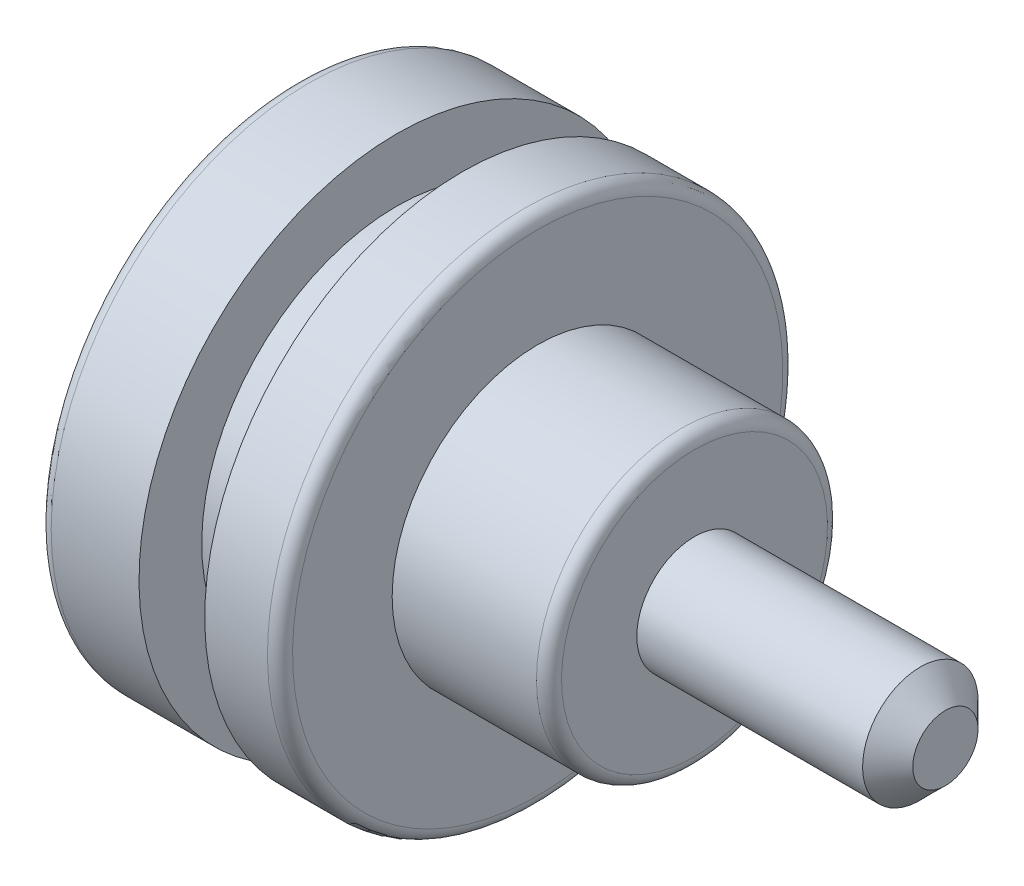
ISO-10303-21;
HEADER;
FILE_DESCRIPTION(('STEP AP214'),'2;1');
FILE_NAME('part.step','',(''),(''),'','','');
FILE_SCHEMA(('AUTOMOTIVE_DESIGN { 1 0 10303 214 1 1 1 1 }'));
ENDSEC;
DATA;
#1=APPLICATION_CONTEXT('core data for automotive mechanical design processes');
#2=APPLICATION_PROTOCOL_DEFINITION('international standard','automotive_design',2000,#1);
#3=PRODUCT_CONTEXT('',#1,'mechanical');
#4=PRODUCT('Part','Part','',(#3));
#5=PRODUCT_RELATED_PRODUCT_CATEGORY('part','',(#4));
#6=PRODUCT_DEFINITION_FORMATION('','',#4);
#7=PRODUCT_DEFINITION_CONTEXT('part definition',#1,'design');
#8=PRODUCT_DEFINITION('design','',#6,#7);
#9=PRODUCT_DEFINITION_SHAPE('','',#8);
#10=(LENGTH_UNIT() NAMED_UNIT(*) SI_UNIT(.MILLI.,.METRE.));
#11=(NAMED_UNIT(*) PLANE_ANGLE_UNIT() SI_UNIT($,.RADIAN.));
#12=(NAMED_UNIT(*) SI_UNIT($,.STERADIAN.) SOLID_ANGLE_UNIT());
#13=UNCERTAINTY_MEASURE_WITH_UNIT(LENGTH_MEASURE(1.E-05),#10,'distance_accuracy_value','');
#14=(GEOMETRIC_REPRESENTATION_CONTEXT(3) GLOBAL_UNCERTAINTY_ASSIGNED_CONTEXT((#13)) GLOBAL_UNIT_ASSIGNED_CONTEXT((#10,
#11,#12)) REPRESENTATION_CONTEXT('',''));
#15=CARTESIAN_POINT('',(0.,0.,0.));
#16=DIRECTION('',(0.,0.,1.));
#17=DIRECTION('',(1.,0.,0.));
#18=AXIS2_PLACEMENT_3D('',#15,#16,#17);
#19=CARTESIAN_POINT('',(25.87,0.,0.));
#20=DIRECTION('',(1.,0.,0.));
#21=DIRECTION('',(0.,1.,0.));
#22=AXIS2_PLACEMENT_3D('',#19,#20,#21);
#23=CYLINDRICAL_SURFACE('',#22,5.);
#24=CARTESIAN_POINT('',(0.500000000000004,0.,0.));
#25=DIRECTION('',(-1.,0.,0.));
#26=DIRECTION('',(0.,-1.,0.));
#27=AXIS2_PLACEMENT_3D('',#24,#25,#26);
#28=CIRCLE('',#27,5.);
#29=CARTESIAN_POINT('',(0.500000000000006,-5.,0.));
#30=VERTEX_POINT('',#29);
#31=EDGE_CURVE('E168',#30,#30,#28,.T.);
#32=ORIENTED_EDGE('',*,*,#31,.T.);
#33=EDGE_LOOP('',(#32));
#34=FACE_BOUND('',#33,.T.);
#35=CARTESIAN_POINT('',(6.5,0.,0.));
#36=DIRECTION('',(1.,0.,0.));
#37=DIRECTION('',(0.,1.,0.));
#38=AXIS2_PLACEMENT_3D('',#35,#36,#37);
#39=CIRCLE('',#38,5.);
#40=CARTESIAN_POINT('',(6.5,4.99999999999999,0.));
#41=VERTEX_POINT('',#40);
#42=EDGE_CURVE('E195',#41,#41,#39,.T.);
#43=ORIENTED_EDGE('',*,*,#42,.T.);
#44=EDGE_LOOP('',(#43));
#45=FACE_BOUND('',#44,.T.);
#46=ADVANCED_FACE('F31',(#34,#45),#23,.F.);
#47=CARTESIAN_POINT('',(0.,4.99999999999999,0.));
#48=DIRECTION('',(-1.,0.,0.));
#49=DIRECTION('',(0.,-1.,0.));
#50=AXIS2_PLACEMENT_3D('',#47,#48,#49);
#51=PLANE('',#50);
#52=CARTESIAN_POINT('',(0.,0.,0.));
#53=DIRECTION('',(-1.,0.,0.));
#54=DIRECTION('',(0.,-1.,0.));
#55=AXIS2_PLACEMENT_3D('',#52,#53,#54);
#56=CIRCLE('',#55,9.77000000000001);
#57=CARTESIAN_POINT('',(0.,-9.77000000000001,0.));
#58=VERTEX_POINT('',#57);
#59=EDGE_CURVE('E173',#58,#58,#56,.T.);
#60=ORIENTED_EDGE('',*,*,#59,.T.);
#61=EDGE_LOOP('',(#60));
#62=FACE_BOUND('',#61,.T.);
#63=CARTESIAN_POINT('',(0.,0.,0.));
#64=DIRECTION('',(-1.,0.,0.));
#65=DIRECTION('',(0.,-1.,0.));
#66=AXIS2_PLACEMENT_3D('',#63,#64,#65);
#67=CIRCLE('',#66,5.5);
#68=CARTESIAN_POINT('',(0.,-5.50000000000001,0.));
#69=VERTEX_POINT('',#68);
#70=EDGE_CURVE('E159',#69,#69,#67,.F.);
#71=ORIENTED_EDGE('',*,*,#70,.T.);
#72=EDGE_LOOP('',(#71));
#73=FACE_BOUND('',#72,.T.);
#74=ADVANCED_FACE('F56',(#62,#73),#51,.T.);
#75=CARTESIAN_POINT('',(25.87,0.,0.));
#76=DIRECTION('',(1.,0.,0.));
#77=DIRECTION('',(0.,1.,0.));
#78=AXIS2_PLACEMENT_3D('',#75,#76,#77);
#79=CYLINDRICAL_SURFACE('',#78,10.27);
#80=CARTESIAN_POINT('',(1.00000000000001,0.,-10.27));
#81=CARTESIAN_POINT('',(1.00000242998855,0.0560281130643778,-10.2699993704205));
#82=CARTESIAN_POINT('',(1.0047245750476,0.112093455686824,-10.2695366323118));
#83=CARTESIAN_POINT('',(1.02349115088352,0.222670323142132,-10.2677351736443));
#84=CARTESIAN_POINT('',(1.03754590160196,0.277180058119849,-10.2663954833801));
#85=CARTESIAN_POINT('',(1.07456511951424,0.383028398348861,-10.2629913753249));
#86=CARTESIAN_POINT('',(1.0975242631602,0.434368877141249,-10.2609273906279));
#87=CARTESIAN_POINT('',(1.15169034189741,0.532456081542478,-10.2563055977148));
#88=CARTESIAN_POINT('',(1.1828956158856,0.579203729733771,-10.2537478889825));
#89=CARTESIAN_POINT('',(1.25278281564404,0.666949574742967,-10.248415459794));
#90=CARTESIAN_POINT('',(1.29148718198973,0.707929861254753,-10.245640103261));
#91=CARTESIAN_POINT('',(1.37522609004017,0.7828238075426,-10.2401904511167));
#92=CARTESIAN_POINT('',(1.42026092181637,0.81673714332349,-10.2375161601435));
#93=CARTESIAN_POINT('',(1.51549392419819,0.876597514777132,-10.2325648790988));
#94=CARTESIAN_POINT('',(1.56570228248863,0.902528415290817,-10.2302886976955));
#95=CARTESIAN_POINT('',(1.6697864058679,0.945584799417025,-10.2263991463674));
#96=CARTESIAN_POINT('',(1.72366208472355,0.962710489993836,-10.224785760864));
#97=CARTESIAN_POINT('',(1.83336933486897,0.987617397594074,-10.2224101623409));
#98=CARTESIAN_POINT('',(1.88919412064404,0.995428241077002,-10.2216452512401));
#99=CARTESIAN_POINT('',(2.00136713942667,1.00157530479113,-10.2210448076504));
#100=CARTESIAN_POINT('',(2.05771535931009,0.999911761938303,-10.2212092519222));
#101=CARTESIAN_POINT('',(2.16913170575749,0.987181704731946,-10.2224464769959));
#102=CARTESIAN_POINT('',(2.22420356492436,0.976147512879492,-10.2235161353673));
#103=CARTESIAN_POINT('',(2.33170996678532,0.945039657925377,-10.2264383843714));
#104=CARTESIAN_POINT('',(2.38414447550893,0.924965878422162,-10.2282909850859));
#105=CARTESIAN_POINT('',(2.48499001088431,0.876312904498565,-10.2325739706715));
#106=CARTESIAN_POINT('',(2.53339406273881,0.847719342337354,-10.2350053301558));
#107=CARTESIAN_POINT('',(2.62472835563628,0.782848799160375,-10.2401710436506));
#108=CARTESIAN_POINT('',(2.66765844477954,0.746571605001985,-10.2429054060655));
#109=CARTESIAN_POINT('',(2.74701402862717,0.667182916408606,-10.2483829416496));
#110=CARTESIAN_POINT('',(2.78341159892257,0.624043502614789,-10.2511261039024));
#111=CARTESIAN_POINT('',(2.84845260583545,0.532251968806636,-10.2563013501735));
#112=CARTESIAN_POINT('',(2.87709603442873,0.483599843087663,-10.2587334338699));
#113=CARTESIAN_POINT('',(2.92581445118141,0.382144796468765,-10.2630132320006));
#114=CARTESIAN_POINT('',(2.94588805307766,0.329341205658619,-10.2648608518789));
#115=CARTESIAN_POINT('',(2.97687669029084,0.221091116857842,-10.2677625620655));
#116=CARTESIAN_POINT('',(2.98779198524246,0.165644693837651,-10.2688166748694));
#117=CARTESIAN_POINT('',(3.00011880819419,0.0539247245096094,-10.2700097114553));
#118=CARTESIAN_POINT('',(3.00156887613904,-0.00234453145175555,-10.270152346488));
#119=CARTESIAN_POINT('',(2.99502526254632,-0.114325281991955,-10.2695163011471));
#120=CARTESIAN_POINT('',(2.98703170186328,-0.17003678369943,-10.2687376325638));
#121=CARTESIAN_POINT('',(2.96185970697426,-0.279209571921278,-10.2663488711761));
#122=CARTESIAN_POINT('',(2.94469928725717,-0.332675050741624,-10.2647404092729));
#123=CARTESIAN_POINT('',(2.90169918944604,-0.435968342019611,-10.2608725495536));
#124=CARTESIAN_POINT('',(2.87585932635461,-0.485796076913252,-10.258613137863));
#125=CARTESIAN_POINT('',(2.81613804585284,-0.580573898391988,-10.2536869554819));
#126=CARTESIAN_POINT('',(2.78223127143605,-0.625507939730963,-10.2510189099347));
#127=CARTESIAN_POINT('',(2.70737506089243,-0.709060520369006,-10.2455790279491));
#128=CARTESIAN_POINT('',(2.66642545731287,-0.747678909462356,-10.2428071890442));
#129=CARTESIAN_POINT('',(2.57847799109753,-0.817637492983392,-10.2374609878956));
#130=CARTESIAN_POINT('',(2.53145997868568,-0.848952417906338,-10.2348873313303));
#131=CARTESIAN_POINT('',(2.43280990322757,-0.903241519658311,-10.2302395045504));
#132=CARTESIAN_POINT('',(2.38117790044683,-0.926215805408522,-10.2281653278131));
#133=CARTESIAN_POINT('',(2.27485262530635,-0.963129043598289,-10.2247556380125));
#134=CARTESIAN_POINT('',(2.22016463953652,-0.977083104824894,-10.2234188903163));
#135=CARTESIAN_POINT('',(2.10920822997594,-0.995608840928293,-10.2216315251989));
#136=CARTESIAN_POINT('',(2.05293984899429,-1.0001807696965,-10.2211808837985));
#137=CARTESIAN_POINT('',(1.94067105561993,-0.999809038717205,-10.2212172330537));
#138=CARTESIAN_POINT('',(1.88467050628405,-0.99490507527169,-10.2217003121802));
#139=CARTESIAN_POINT('',(1.7742927546853,-0.975803919641461,-10.2235413362366));
#140=CARTESIAN_POINT('',(1.71991555437152,-0.961606716299128,-10.2248992822169));
#141=CARTESIAN_POINT('',(1.61432789032251,-0.924332892776758,-10.2283359579971));
#142=CARTESIAN_POINT('',(1.56311703837049,-0.901257363658239,-10.2304145992273));
#143=CARTESIAN_POINT('',(1.4652891312458,-0.846886059736792,-10.2350586319536));
#144=CARTESIAN_POINT('',(1.41867204253179,-0.815590344959651,-10.2376240198953));
#145=CARTESIAN_POINT('',(1.33115152434555,-0.745517895179133,-10.2429653528404));
#146=CARTESIAN_POINT('',(1.29027181035054,-0.706711600280801,-10.2457421026138));
#147=CARTESIAN_POINT('',(1.21558667072025,-0.622777444947051,-10.2511859325055));
#148=CARTESIAN_POINT('',(1.18178294476704,-0.577648070017005,-10.253852986151));
#149=CARTESIAN_POINT('',(1.12214618772614,-0.482230996870192,-10.2587835184235));
#150=CARTESIAN_POINT('',(1.09633251845895,-0.431931155872996,-10.2610460111912));
#151=CARTESIAN_POINT('',(1.0535518128014,-0.327721412102347,-10.2649016649106));
#152=CARTESIAN_POINT('',(1.03657476870825,-0.273815671558515,-10.2664955826414));
#153=CARTESIAN_POINT('',(1.01619787846441,-0.183002122542636,-10.2684325167236));
#154=CARTESIAN_POINT('',(1.01013193488893,-0.146675457412226,-10.2690175930152));
#155=CARTESIAN_POINT('',(1.00203220555385,-0.0735712121618044,-10.2698015406301));
#156=CARTESIAN_POINT('',(0.999998404227751,-0.0367936337831414,-10.2700004134445));
#157=CARTESIAN_POINT('',(1.00000000000001,0.,-10.27));
#158=B_SPLINE_CURVE_WITH_KNOTS('',3,(#80,#81,#82,#83,#84,#85,#86,#87,#88,#89,#90,#91,#92,#93,
#94,#95,#96,#97,#98,#99,#100,#101,#102,#103,#104,#105,#106,#107,#108,#109,#110,#111,#112,#113,
#114,#115,#116,#117,#118,#119,#120,#121,#122,#123,#124,#125,#126,#127,#128,#129,#130,#131,#132,
#133,#134,#135,#136,#137,#138,#139,#140,#141,#142,#143,#144,#145,#146,#147,#148,#149,#150,#151,
#152,#153,#154,#155,#156,#157),.UNSPECIFIED.,.T.,.F.,(4,2,2,2,2,2,2,2,2,2,2,2,2,2,2,2,2,2,2,2,2,
2,2,2,2,2,2,2,2,2,2,2,2,2,2,2,2,2,4),(0.,0.167949985952147,0.3360859999992,0.504121647433769,
0.672123471484731,0.840636019713048,1.00915629195811,1.17801499633117,1.34686973154057,
1.51518596894515,1.6834979974618,1.85123180862895,2.01896777974356,2.1869882369829,
2.35501335569126,2.52374045493077,2.69246772877319,2.86122228576439,3.02997205846299,
3.19803429503663,3.36609438086269,3.53382540757358,3.70156000960264,3.86982899074342,
4.0381019732585,4.20694880686126,4.37579343539816,4.54435451296447,4.71291102901192,
4.88076296060038,5.04861509371503,5.21644660598927,5.38427689275122,5.55278167026844,
5.72132687701255,5.89027736820422,6.0590361000444,6.16932919748639,6.27962186912973),.UNSPECIFIED.);
#159=CARTESIAN_POINT('',(1.00000000000001,0.,-10.27));
#160=VERTEX_POINT('',#159);
#161=EDGE_CURVE('E40',#160,#160,#158,.T.);
#162=ORIENTED_EDGE('',*,*,#161,.F.);
#163=EDGE_LOOP('',(#162));
#164=FACE_BOUND('',#163,.T.);
#165=CARTESIAN_POINT('',(0.500000000000004,0.,0.));
#166=DIRECTION('',(-1.,0.,0.));
#167=DIRECTION('',(0.,-1.,0.));
#168=AXIS2_PLACEMENT_3D('',#165,#166,#167);
#169=CIRCLE('',#168,10.27);
#170=CARTESIAN_POINT('',(0.500000000000008,-10.27,0.));
#171=VERTEX_POINT('',#170);
#172=EDGE_CURVE('E170',#171,#171,#169,.F.);
#173=ORIENTED_EDGE('',*,*,#172,.T.);
#174=EDGE_LOOP('',(#173));
#175=FACE_BOUND('',#174,.T.);
#176=CARTESIAN_POINT('',(4.,0.,0.));
#177=DIRECTION('',(1.,0.,0.));
#178=DIRECTION('',(0.,1.,0.));
#179=AXIS2_PLACEMENT_3D('',#176,#177,#178);
#180=CIRCLE('',#179,10.27);
#181=CARTESIAN_POINT('',(4.,10.27,0.));
#182=VERTEX_POINT('',#181);
#183=EDGE_CURVE('E153',#182,#182,#180,.T.);
#184=ORIENTED_EDGE('',*,*,#183,.F.);
#185=EDGE_LOOP('',(#184));
#186=FACE_BOUND('',#185,.T.);
#187=ADVANCED_FACE('F62',(#164,#175,#186),#79,.T.);
#188=CARTESIAN_POINT('',(4.,10.27,0.));
#189=DIRECTION('',(1.,0.,0.));
#190=DIRECTION('',(0.,1.,0.));
#191=AXIS2_PLACEMENT_3D('',#188,#189,#190);
#192=PLANE('',#191);
#193=ORIENTED_EDGE('',*,*,#183,.T.);
#194=EDGE_LOOP('',(#193));
#195=FACE_BOUND('',#194,.T.);
#196=CARTESIAN_POINT('',(4.,0.,0.));
#197=DIRECTION('',(1.,0.,0.));
#198=DIRECTION('',(0.,1.,0.));
#199=AXIS2_PLACEMENT_3D('',#196,#197,#198);
#200=CIRCLE('',#199,7.77000000000001);
#201=CARTESIAN_POINT('',(4.,7.77,0.));
#202=VERTEX_POINT('',#201);
#203=EDGE_CURVE('E156',#202,#202,#200,.T.);
#204=ORIENTED_EDGE('',*,*,#203,.F.);
#205=EDGE_LOOP('',(#204));
#206=FACE_BOUND('',#205,.T.);
#207=ADVANCED_FACE('F142',(#195,#206),#192,.T.);
#208=CARTESIAN_POINT('',(25.87,0.,0.));
#209=DIRECTION('',(1.,0.,0.));
#210=DIRECTION('',(0.,1.,0.));
#211=AXIS2_PLACEMENT_3D('',#208,#209,#210);
#212=CYLINDRICAL_SURFACE('',#211,7.77000000000001);
#213=ORIENTED_EDGE('',*,*,#203,.T.);
#214=EDGE_LOOP('',(#213));
#215=FACE_BOUND('',#214,.T.);
#216=CARTESIAN_POINT('',(6.62,0.,0.));
#217=DIRECTION('',(1.,0.,0.));
#218=DIRECTION('',(0.,1.,0.));
#219=AXIS2_PLACEMENT_3D('',#216,#217,#218);
#220=CIRCLE('',#219,7.77000000000001);
#221=CARTESIAN_POINT('',(6.62,7.77000000000001,0.));
#222=VERTEX_POINT('',#221);
#223=EDGE_CURVE('E157',#222,#222,#220,.T.);
#224=ORIENTED_EDGE('',*,*,#223,.F.);
#225=EDGE_LOOP('',(#224));
#226=FACE_BOUND('',#225,.T.);
#227=ADVANCED_FACE('F139',(#215,#226),#212,.T.);
#228=CARTESIAN_POINT('',(6.62,7.77000000000001,0.));
#229=DIRECTION('',(-1.,0.,0.));
#230=DIRECTION('',(0.,-1.,0.));
#231=AXIS2_PLACEMENT_3D('',#228,#229,#230);
#232=PLANE('',#231);
#233=ORIENTED_EDGE('',*,*,#223,.T.);
#234=EDGE_LOOP('',(#233));
#235=FACE_BOUND('',#234,.T.);
#236=CARTESIAN_POINT('',(6.62,0.,0.));
#237=DIRECTION('',(1.,0.,0.));
#238=DIRECTION('',(0.,1.,0.));
#239=AXIS2_PLACEMENT_3D('',#236,#237,#238);
#240=CIRCLE('',#239,10.27);
#241=CARTESIAN_POINT('',(6.62,10.27,0.));
#242=VERTEX_POINT('',#241);
#243=EDGE_CURVE('E162',#242,#242,#240,.T.);
#244=ORIENTED_EDGE('',*,*,#243,.F.);
#245=EDGE_LOOP('',(#244));
#246=FACE_BOUND('',#245,.T.);
#247=ADVANCED_FACE('F135',(#235,#246),#232,.T.);
#248=CARTESIAN_POINT('',(25.87,0.,0.));
#249=DIRECTION('',(1.,0.,0.));
#250=DIRECTION('',(0.,1.,0.));
#251=AXIS2_PLACEMENT_3D('',#248,#249,#250);
#252=CYLINDRICAL_SURFACE('',#251,10.27);
#253=CARTESIAN_POINT('',(9.12,0.,0.));
#254=DIRECTION('',(1.,0.,0.));
#255=DIRECTION('',(0.,1.,0.));
#256=AXIS2_PLACEMENT_3D('',#253,#254,#255);
#257=CIRCLE('',#256,10.27);
#258=CARTESIAN_POINT('',(9.11999999999999,10.27,0.));
#259=VERTEX_POINT('',#258);
#260=EDGE_CURVE('E93',#259,#259,#257,.F.);
#261=ORIENTED_EDGE('',*,*,#260,.T.);
#262=EDGE_LOOP('',(#261));
#263=FACE_BOUND('',#262,.T.);
#264=ORIENTED_EDGE('',*,*,#243,.T.);
#265=EDGE_LOOP('',(#264));
#266=FACE_BOUND('',#265,.T.);
#267=ADVANCED_FACE('F131',(#263,#266),#252,.T.);
#268=CARTESIAN_POINT('',(9.62,10.27,0.));
#269=DIRECTION('',(1.,0.,0.));
#270=DIRECTION('',(0.,1.,0.));
#271=AXIS2_PLACEMENT_3D('',#268,#269,#270);
#272=PLANE('',#271);
#273=CARTESIAN_POINT('',(9.62,0.,0.));
#274=DIRECTION('',(1.,0.,0.));
#275=DIRECTION('',(0.,1.,0.));
#276=AXIS2_PLACEMENT_3D('',#273,#274,#275);
#277=CIRCLE('',#276,9.77000000000001);
#278=CARTESIAN_POINT('',(9.62,9.77000000000001,0.));
#279=VERTEX_POINT('',#278);
#280=EDGE_CURVE('E97',#279,#279,#277,.T.);
#281=ORIENTED_EDGE('',*,*,#280,.T.);
#282=EDGE_LOOP('',(#281));
#283=FACE_BOUND('',#282,.T.);
#284=CARTESIAN_POINT('',(9.62,0.,0.));
#285=DIRECTION('',(1.,0.,0.));
#286=DIRECTION('',(0.,1.,0.));
#287=AXIS2_PLACEMENT_3D('',#284,#285,#286);
#288=CIRCLE('',#287,5.8);
#289=CARTESIAN_POINT('',(9.62,5.8,0.));
#290=VERTEX_POINT('',#289);
#291=EDGE_CURVE('E181',#290,#290,#288,.T.);
#292=ORIENTED_EDGE('',*,*,#291,.F.);
#293=EDGE_LOOP('',(#292));
#294=FACE_BOUND('',#293,.T.);
#295=ADVANCED_FACE('F127',(#283,#294),#272,.T.);
#296=CARTESIAN_POINT('',(25.87,0.,0.));
#297=DIRECTION('',(1.,0.,0.));
#298=DIRECTION('',(0.,1.,0.));
#299=AXIS2_PLACEMENT_3D('',#296,#297,#298);
#300=CYLINDRICAL_SURFACE('',#299,5.8);
#301=CARTESIAN_POINT('',(15.37,0.,0.));
#302=DIRECTION('',(1.,0.,0.));
#303=DIRECTION('',(0.,1.,0.));
#304=AXIS2_PLACEMENT_3D('',#301,#302,#303);
#305=CIRCLE('',#304,5.8);
#306=CARTESIAN_POINT('',(15.37,5.8,0.));
#307=VERTEX_POINT('',#306);
#308=EDGE_CURVE('E88',#307,#307,#305,.F.);
#309=ORIENTED_EDGE('',*,*,#308,.T.);
#310=EDGE_LOOP('',(#309));
#311=FACE_BOUND('',#310,.T.);
#312=ORIENTED_EDGE('',*,*,#291,.T.);
#313=EDGE_LOOP('',(#312));
#314=FACE_BOUND('',#313,.T.);
#315=ADVANCED_FACE('F124',(#311,#314),#300,.T.);
#316=CARTESIAN_POINT('',(15.87,5.8,0.));
#317=DIRECTION('',(1.,0.,0.));
#318=DIRECTION('',(0.,1.,0.));
#319=AXIS2_PLACEMENT_3D('',#316,#317,#318);
#320=PLANE('',#319);
#321=CARTESIAN_POINT('',(15.87,0.,0.));
#322=DIRECTION('',(1.,0.,0.));
#323=DIRECTION('',(0.,1.,0.));
#324=AXIS2_PLACEMENT_3D('',#321,#322,#323);
#325=CIRCLE('',#324,5.3);
#326=CARTESIAN_POINT('',(15.87,5.3,0.));
#327=VERTEX_POINT('',#326);
#328=EDGE_CURVE('E91',#327,#327,#325,.T.);
#329=ORIENTED_EDGE('',*,*,#328,.T.);
#330=EDGE_LOOP('',(#329));
#331=FACE_BOUND('',#330,.T.);
#332=CARTESIAN_POINT('',(15.87,0.,0.));
#333=DIRECTION('',(1.,0.,0.));
#334=DIRECTION('',(0.,1.,0.));
#335=AXIS2_PLACEMENT_3D('',#332,#333,#334);
#336=CIRCLE('',#335,2.3);
#337=CARTESIAN_POINT('',(15.87,2.30000000000001,0.));
#338=VERTEX_POINT('',#337);
#339=EDGE_CURVE('E183',#338,#338,#336,.T.);
#340=ORIENTED_EDGE('',*,*,#339,.F.);
#341=EDGE_LOOP('',(#340));
#342=FACE_BOUND('',#341,.T.);
#343=ADVANCED_FACE('F120',(#331,#342),#320,.T.);
#344=CARTESIAN_POINT('',(25.87,0.,0.));
#345=DIRECTION('',(1.,0.,0.));
#346=DIRECTION('',(0.,1.,0.));
#347=AXIS2_PLACEMENT_3D('',#344,#345,#346);
#348=CYLINDRICAL_SURFACE('',#347,2.3);
#349=ORIENTED_EDGE('',*,*,#339,.T.);
#350=EDGE_LOOP('',(#349));
#351=FACE_BOUND('',#350,.T.);
#352=CARTESIAN_POINT('',(24.87,0.,0.));
#353=DIRECTION('',(1.,0.,0.));
#354=DIRECTION('',(0.,1.,0.));
#355=AXIS2_PLACEMENT_3D('',#352,#353,#354);
#356=CIRCLE('',#355,2.3);
#357=CARTESIAN_POINT('',(24.87,2.30000000000001,0.));
#358=VERTEX_POINT('',#357);
#359=EDGE_CURVE('E187',#358,#358,#356,.T.);
#360=ORIENTED_EDGE('',*,*,#359,.F.);
#361=EDGE_LOOP('',(#360));
#362=FACE_BOUND('',#361,.T.);
#363=ADVANCED_FACE('F116',(#351,#362),#348,.T.);
#364=CARTESIAN_POINT('',(25.87,0.,0.));
#365=DIRECTION('',(-1.,0.,0.));
#366=DIRECTION('',(0.,-1.,0.));
#367=AXIS2_PLACEMENT_3D('',#364,#365,#366);
#368=CONICAL_SURFACE('',#367,1.3,0.785398163397448);
#369=ORIENTED_EDGE('',*,*,#359,.T.);
#370=EDGE_LOOP('',(#369));
#371=FACE_BOUND('',#370,.T.);
#372=CARTESIAN_POINT('',(25.87,0.,0.));
#373=DIRECTION('',(1.,0.,0.));
#374=DIRECTION('',(0.,1.,0.));
#375=AXIS2_PLACEMENT_3D('',#372,#373,#374);
#376=CIRCLE('',#375,1.3);
#377=CARTESIAN_POINT('',(25.87,1.30000000000001,0.));
#378=VERTEX_POINT('',#377);
#379=EDGE_CURVE('E192',#378,#378,#376,.T.);
#380=ORIENTED_EDGE('',*,*,#379,.F.);
#381=EDGE_LOOP('',(#380));
#382=FACE_BOUND('',#381,.T.);
#383=ADVANCED_FACE('F112',(#371,#382),#368,.T.);
#384=CARTESIAN_POINT('',(25.87,1.30000000000001,0.));
#385=DIRECTION('',(1.,0.,0.));
#386=DIRECTION('',(0.,1.,0.));
#387=AXIS2_PLACEMENT_3D('',#384,#385,#386);
#388=PLANE('',#387);
#389=ORIENTED_EDGE('',*,*,#379,.T.);
#390=EDGE_LOOP('',(#389));
#391=FACE_BOUND('',#390,.T.);
#392=ADVANCED_FACE('F109',(#391),#388,.T.);
#393=CARTESIAN_POINT('',(6.5,0.,0.));
#394=DIRECTION('',(-1.,0.,0.));
#395=DIRECTION('',(0.,-1.,0.));
#396=AXIS2_PLACEMENT_3D('',#393,#394,#395);
#397=CONICAL_SURFACE('',#396,5.,1.04719755119659);
#398=CARTESIAN_POINT('',(9.38675134594816,0.,0.));
#399=VERTEX_POINT('',#398);
#400=VERTEX_LOOP('',#399);
#401=FACE_BOUND('',#400,.T.);
#402=ORIENTED_EDGE('',*,*,#42,.F.);
#403=EDGE_LOOP('',(#402));
#404=FACE_BOUND('',#403,.T.);
#405=ADVANCED_FACE('F73',(#401,#404),#397,.F.);
#406=CARTESIAN_POINT('',(0.500000000000004,0.,0.));
#407=DIRECTION('',(-1.,0.,0.));
#408=DIRECTION('',(0.,-1.,0.));
#409=AXIS2_PLACEMENT_3D('',#406,#407,#408);
#410=TOROIDAL_SURFACE('',#409,5.5,0.5);
#411=ORIENTED_EDGE('',*,*,#31,.F.);
#412=EDGE_LOOP('',(#411));
#413=FACE_BOUND('',#412,.T.);
#414=ORIENTED_EDGE('',*,*,#70,.F.);
#415=EDGE_LOOP('',(#414));
#416=FACE_BOUND('',#415,.T.);
#417=ADVANCED_FACE('F69',(#413,#416),#410,.T.);
#418=CARTESIAN_POINT('',(0.500000000000004,0.,0.));
#419=DIRECTION('',(-1.,0.,0.));
#420=DIRECTION('',(0.,-1.,0.));
#421=AXIS2_PLACEMENT_3D('',#418,#419,#420);
#422=TOROIDAL_SURFACE('',#421,9.77000000000001,0.5);
#423=ORIENTED_EDGE('',*,*,#59,.F.);
#424=EDGE_LOOP('',(#423));
#425=FACE_BOUND('',#424,.T.);
#426=ORIENTED_EDGE('',*,*,#172,.F.);
#427=EDGE_LOOP('',(#426));
#428=FACE_BOUND('',#427,.T.);
#429=ADVANCED_FACE('F72',(#425,#428),#422,.T.);
#430=CARTESIAN_POINT('',(9.12,0.,0.));
#431=DIRECTION('',(1.,0.,0.));
#432=DIRECTION('',(0.,1.,0.));
#433=AXIS2_PLACEMENT_3D('',#430,#431,#432);
#434=TOROIDAL_SURFACE('',#433,9.77000000000001,0.5);
#435=ORIENTED_EDGE('',*,*,#260,.F.);
#436=EDGE_LOOP('',(#435));
#437=FACE_BOUND('',#436,.T.);
#438=ORIENTED_EDGE('',*,*,#280,.F.);
#439=EDGE_LOOP('',(#438));
#440=FACE_BOUND('',#439,.T.);
#441=ADVANCED_FACE('F77',(#437,#440),#434,.T.);
#442=CARTESIAN_POINT('',(15.37,0.,0.));
#443=DIRECTION('',(1.,0.,0.));
#444=DIRECTION('',(0.,1.,0.));
#445=AXIS2_PLACEMENT_3D('',#442,#443,#444);
#446=TOROIDAL_SURFACE('',#445,5.3,0.5);
#447=ORIENTED_EDGE('',*,*,#308,.F.);
#448=EDGE_LOOP('',(#447));
#449=FACE_BOUND('',#448,.T.);
#450=ORIENTED_EDGE('',*,*,#328,.F.);
#451=EDGE_LOOP('',(#450));
#452=FACE_BOUND('',#451,.T.);
#453=ADVANCED_FACE('F51',(#449,#452),#446,.T.);
#454=CARTESIAN_POINT('',(2.00000000000001,0.,-7.27000000000001));
#455=DIRECTION('',(0.,0.,-1.));
#456=DIRECTION('',(-1.,0.,0.));
#457=AXIS2_PLACEMENT_3D('',#454,#455,#456);
#458=CYLINDRICAL_SURFACE('',#457,1.);
#459=CARTESIAN_POINT('',(2.00000000000001,0.,-8.27000000000001));
#460=DIRECTION('',(0.,0.,-1.));
#461=DIRECTION('',(-1.,0.,0.));
#462=AXIS2_PLACEMENT_3D('',#459,#460,#461);
#463=CIRCLE('',#462,1.);
#464=CARTESIAN_POINT('',(1.00000000000001,0.,-8.27000000000001));
#465=VERTEX_POINT('',#464);
#466=EDGE_CURVE('E11',#465,#465,#463,.F.);
#467=ORIENTED_EDGE('',*,*,#466,.T.);
#468=EDGE_LOOP('',(#467));
#469=FACE_BOUND('',#468,.T.);
#470=ORIENTED_EDGE('',*,*,#161,.T.);
#471=EDGE_LOOP('',(#470));
#472=FACE_BOUND('',#471,.T.);
#473=ADVANCED_FACE('F46',(#469,#472),#458,.F.);
#474=CARTESIAN_POINT('',(2.00000000000001,0.,-8.27000000000001));
#475=DIRECTION('',(0.,0.,-1.));
#476=DIRECTION('',(-1.,0.,0.));
#477=AXIS2_PLACEMENT_3D('',#474,#475,#476);
#478=CONICAL_SURFACE('',#477,1.00000000000001,0.785398163397453);
#479=ORIENTED_EDGE('',*,*,#466,.F.);
#480=EDGE_LOOP('',(#479));
#481=FACE_BOUND('',#480,.T.);
#482=CARTESIAN_POINT('',(2.00000000000002,0.,-7.27000000000001));
#483=VERTEX_POINT('',#482);
#484=VERTEX_LOOP('',#483);
#485=FACE_BOUND('',#484,.T.);
#486=ADVANCED_FACE('F33',(#481,#485),#478,.F.);
#487=CLOSED_SHELL('',(#46,#74,#187,#207,#227,#247,#267,#295,#315,#343,#363,#383,#392,#405,#417,
#429,#441,#453,#473,#486));
#488=MANIFOLD_SOLID_BREP('B2',#487);
#489=ADVANCED_BREP_SHAPE_REPRESENTATION('',(#18,#488),#14);
#490=SHAPE_DEFINITION_REPRESENTATION(#9,#489);
ENDSEC;
END-ISO-10303-21;
